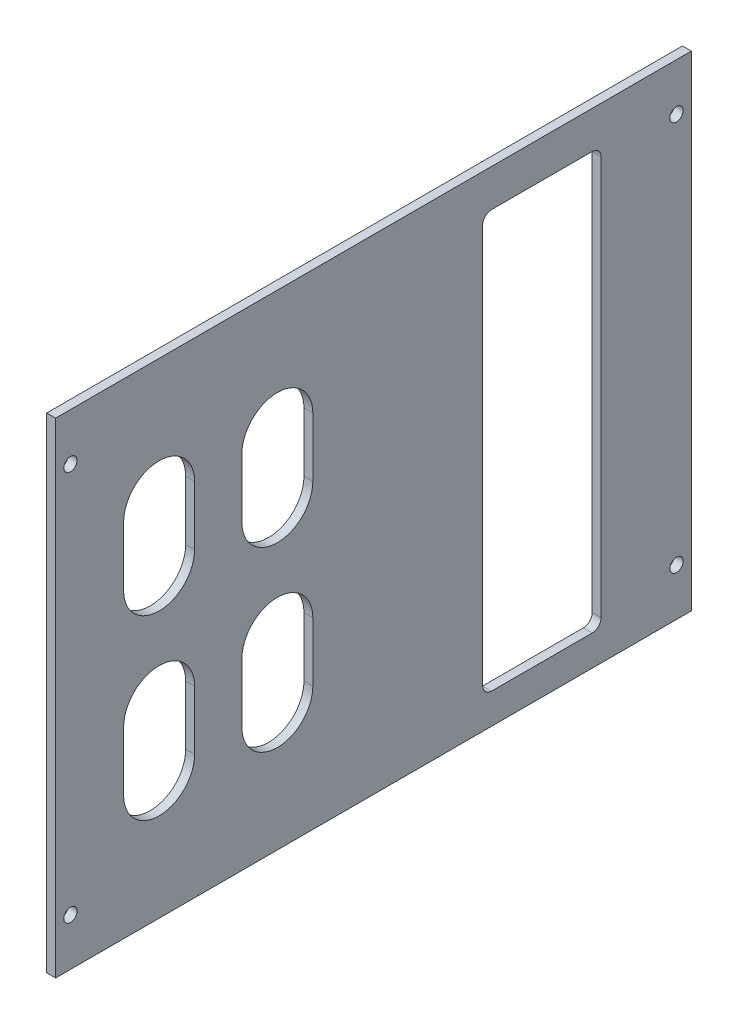
ISO-10303-21;
HEADER;
FILE_DESCRIPTION(('STEP AP214'),'2;1');
FILE_NAME('part.step','',(''),(''),'','','');
FILE_SCHEMA(('AUTOMOTIVE_DESIGN { 1 0 10303 214 1 1 1 1 }'));
ENDSEC;
DATA;
#1=APPLICATION_CONTEXT('core data for automotive mechanical design processes');
#2=APPLICATION_PROTOCOL_DEFINITION('international standard','automotive_design',2000,#1);
#3=PRODUCT_CONTEXT('',#1,'mechanical');
#4=PRODUCT('Part','Part','',(#3));
#5=PRODUCT_RELATED_PRODUCT_CATEGORY('part','',(#4));
#6=PRODUCT_DEFINITION_FORMATION('','',#4);
#7=PRODUCT_DEFINITION_CONTEXT('part definition',#1,'design');
#8=PRODUCT_DEFINITION('design','',#6,#7);
#9=PRODUCT_DEFINITION_SHAPE('','',#8);
#10=(LENGTH_UNIT() NAMED_UNIT(*) SI_UNIT(.MILLI.,.METRE.));
#11=(NAMED_UNIT(*) PLANE_ANGLE_UNIT() SI_UNIT($,.RADIAN.));
#12=(NAMED_UNIT(*) SI_UNIT($,.STERADIAN.) SOLID_ANGLE_UNIT());
#13=UNCERTAINTY_MEASURE_WITH_UNIT(LENGTH_MEASURE(1.E-05),#10,'distance_accuracy_value','');
#14=(GEOMETRIC_REPRESENTATION_CONTEXT(3) GLOBAL_UNCERTAINTY_ASSIGNED_CONTEXT((#13)) GLOBAL_UNIT_ASSIGNED_CONTEXT((#10,
#11,#12)) REPRESENTATION_CONTEXT('',''));
#15=CARTESIAN_POINT('',(0.,0.,0.));
#16=DIRECTION('',(0.,0.,1.));
#17=DIRECTION('',(1.,0.,0.));
#18=AXIS2_PLACEMENT_3D('',#15,#16,#17);
#19=CARTESIAN_POINT('',(120.,0.,0.));
#20=DIRECTION('',(-1.,0.,0.));
#21=DIRECTION('',(0.,-1.,0.));
#22=AXIS2_PLACEMENT_3D('',#19,#20,#21);
#23=PLANE('',#22);
#24=DIRECTION('',(0.,0.,-1.));
#25=VECTOR('',#24,1.);
#26=CARTESIAN_POINT('',(120.,-71.6875198123391,-34.4530254311954));
#27=LINE('',#26,#25);
#28=CARTESIAN_POINT('',(120.,-71.6875198123391,-34.4530254311954));
#29=VERTEX_POINT('',#28);
#30=CARTESIAN_POINT('',(120.,-71.6875198123391,-68.4854696483238));
#31=VERTEX_POINT('',#30);
#32=EDGE_CURVE('E280',#29,#31,#27,.T.);
#33=ORIENTED_EDGE('',*,*,#32,.F.);
#34=CARTESIAN_POINT('',(120.,-68.6875198123391,-34.4530254311954));
#35=DIRECTION('',(1.,0.,0.));
#36=DIRECTION('',(0.,-1.,0.));
#37=AXIS2_PLACEMENT_3D('',#34,#35,#36);
#38=CIRCLE('',#37,3.);
#39=CARTESIAN_POINT('',(120.,-68.6875198123391,-31.4530254311954));
#40=VERTEX_POINT('',#39);
#41=EDGE_CURVE('E72',#40,#29,#38,.T.);
#42=ORIENTED_EDGE('',*,*,#41,.F.);
#43=DIRECTION('',(0.,-1.,0.));
#44=VECTOR('',#43,1.);
#45=CARTESIAN_POINT('',(120.,66.34986058339,-31.4530254311954));
#46=LINE('',#45,#44);
#47=CARTESIAN_POINT('',(120.,66.34986058339,-31.4530254311954));
#48=VERTEX_POINT('',#47);
#49=EDGE_CURVE('E260',#48,#40,#46,.T.);
#50=ORIENTED_EDGE('',*,*,#49,.F.);
#51=CARTESIAN_POINT('',(120.,66.34986058339,-34.4530254311954));
#52=DIRECTION('',(1.,0.,0.));
#53=DIRECTION('',(0.,-1.,0.));
#54=AXIS2_PLACEMENT_3D('',#51,#52,#53);
#55=CIRCLE('',#54,3.);
#56=CARTESIAN_POINT('',(120.,69.34986058339,-34.4530254311954));
#57=VERTEX_POINT('',#56);
#58=EDGE_CURVE('E263',#57,#48,#55,.T.);
#59=ORIENTED_EDGE('',*,*,#58,.F.);
#60=DIRECTION('',(0.,0.,1.));
#61=VECTOR('',#60,1.);
#62=CARTESIAN_POINT('',(120.,69.34986058339,-34.4530254311954));
#63=LINE('',#62,#61);
#64=CARTESIAN_POINT('',(120.,69.34986058339,-68.4854696483238));
#65=VERTEX_POINT('',#64);
#66=EDGE_CURVE('E291',#65,#57,#63,.T.);
#67=ORIENTED_EDGE('',*,*,#66,.F.);
#68=CARTESIAN_POINT('',(120.,66.34986058339,-68.4854696483238));
#69=DIRECTION('',(1.,0.,0.));
#70=DIRECTION('',(0.,1.,0.));
#71=AXIS2_PLACEMENT_3D('',#68,#69,#70);
#72=CIRCLE('',#71,3.);
#73=CARTESIAN_POINT('',(120.,66.34986058339,-71.4854696483238));
#74=VERTEX_POINT('',#73);
#75=EDGE_CURVE('E288',#74,#65,#72,.T.);
#76=ORIENTED_EDGE('',*,*,#75,.F.);
#77=DIRECTION('',(0.,1.,0.));
#78=VECTOR('',#77,1.);
#79=CARTESIAN_POINT('',(120.,66.34986058339,-71.4854696483238));
#80=LINE('',#79,#78);
#81=CARTESIAN_POINT('',(120.,-68.6875198123391,-71.4854696483238));
#82=VERTEX_POINT('',#81);
#83=EDGE_CURVE('E285',#82,#74,#80,.T.);
#84=ORIENTED_EDGE('',*,*,#83,.F.);
#85=CARTESIAN_POINT('',(120.,-68.6875198123391,-68.4854696483238));
#86=DIRECTION('',(1.,0.,0.));
#87=DIRECTION('',(0.,1.,0.));
#88=AXIS2_PLACEMENT_3D('',#85,#86,#87);
#89=CIRCLE('',#88,3.);
#90=EDGE_CURVE('E282',#31,#82,#89,.T.);
#91=ORIENTED_EDGE('',*,*,#90,.F.);
#92=EDGE_LOOP('',(#33,#42,#50,#59,#67,#76,#84,#91));
#93=FACE_BOUND('',#92,.T.);
#94=CARTESIAN_POINT('',(120.,-66.,108.));
#95=DIRECTION('',(-1.,0.,0.));
#96=DIRECTION('',(0.,-1.,0.));
#97=AXIS2_PLACEMENT_3D('',#94,#95,#96);
#98=CIRCLE('',#97,2.25);
#99=CARTESIAN_POINT('',(120.,-68.25,108.));
#100=VERTEX_POINT('',#99);
#101=EDGE_CURVE('E314',#100,#100,#98,.T.);
#102=ORIENTED_EDGE('',*,*,#101,.T.);
#103=EDGE_LOOP('',(#102));
#104=FACE_BOUND('',#103,.T.);
#105=CARTESIAN_POINT('',(120.,66.,108.));
#106=DIRECTION('',(-1.,0.,0.));
#107=DIRECTION('',(0.,-1.,0.));
#108=AXIS2_PLACEMENT_3D('',#105,#106,#107);
#109=CIRCLE('',#108,2.25);
#110=CARTESIAN_POINT('',(120.,63.75,108.));
#111=VERTEX_POINT('',#110);
#112=EDGE_CURVE('E310',#111,#111,#109,.T.);
#113=ORIENTED_EDGE('',*,*,#112,.T.);
#114=EDGE_LOOP('',(#113));
#115=FACE_BOUND('',#114,.T.);
#116=DIRECTION('',(0.,-1.,0.));
#117=VECTOR('',#116,1.);
#118=CARTESIAN_POINT('',(120.,39.9999999999999,90.));
#119=LINE('',#118,#117);
#120=CARTESIAN_POINT('',(120.,40.,90.));
#121=VERTEX_POINT('',#120);
#122=CARTESIAN_POINT('',(120.,19.9999999999999,90.));
#123=VERTEX_POINT('',#122);
#124=EDGE_CURVE('E320',#121,#123,#119,.T.);
#125=ORIENTED_EDGE('',*,*,#124,.F.);
#126=CARTESIAN_POINT('',(120.,39.9999999999999,78.));
#127=DIRECTION('',(1.,0.,0.));
#128=DIRECTION('',(0.,1.,0.));
#129=AXIS2_PLACEMENT_3D('',#126,#127,#128);
#130=CIRCLE('',#129,12.);
#131=CARTESIAN_POINT('',(120.,39.9999999999999,66.));
#132=VERTEX_POINT('',#131);
#133=EDGE_CURVE('E318',#132,#121,#130,.T.);
#134=ORIENTED_EDGE('',*,*,#133,.F.);
#135=DIRECTION('',(0.,1.,0.));
#136=VECTOR('',#135,1.);
#137=CARTESIAN_POINT('',(120.,39.9999999999999,66.));
#138=LINE('',#137,#136);
#139=CARTESIAN_POINT('',(120.,19.9999999999999,66.));
#140=VERTEX_POINT('',#139);
#141=EDGE_CURVE('E327',#140,#132,#138,.T.);
#142=ORIENTED_EDGE('',*,*,#141,.F.);
#143=CARTESIAN_POINT('',(120.,19.9999999999999,78.));
#144=DIRECTION('',(1.,0.,0.));
#145=DIRECTION('',(0.,1.,0.));
#146=AXIS2_PLACEMENT_3D('',#143,#144,#145);
#147=CIRCLE('',#146,12.);
#148=EDGE_CURVE('E324',#123,#140,#147,.T.);
#149=ORIENTED_EDGE('',*,*,#148,.F.);
#150=EDGE_LOOP('',(#125,#134,#142,#149));
#151=FACE_BOUND('',#150,.T.);
#152=DIRECTION('',(0.,1.,0.));
#153=VECTOR('',#152,1.);
#154=CARTESIAN_POINT('',(120.,-40.0000000000001,66.));
#155=LINE('',#154,#153);
#156=CARTESIAN_POINT('',(120.,-40.0000000000001,66.));
#157=VERTEX_POINT('',#156);
#158=CARTESIAN_POINT('',(120.,-20.0000000000001,66.));
#159=VERTEX_POINT('',#158);
#160=EDGE_CURVE('E356',#157,#159,#155,.T.);
#161=ORIENTED_EDGE('',*,*,#160,.F.);
#162=CARTESIAN_POINT('',(120.,-40.0000000000001,78.));
#163=DIRECTION('',(1.,0.,0.));
#164=DIRECTION('',(0.,-1.,0.));
#165=AXIS2_PLACEMENT_3D('',#162,#163,#164);
#166=CIRCLE('',#165,12.);
#167=CARTESIAN_POINT('',(120.,-40.0000000000001,90.));
#168=VERTEX_POINT('',#167);
#169=EDGE_CURVE('E321',#168,#157,#166,.T.);
#170=ORIENTED_EDGE('',*,*,#169,.F.);
#171=DIRECTION('',(0.,-1.,0.));
#172=VECTOR('',#171,1.);
#173=CARTESIAN_POINT('',(120.,-40.0000000000001,90.));
#174=LINE('',#173,#172);
#175=CARTESIAN_POINT('',(120.,-20.0000000000001,90.));
#176=VERTEX_POINT('',#175);
#177=EDGE_CURVE('E343',#176,#168,#174,.T.);
#178=ORIENTED_EDGE('',*,*,#177,.F.);
#179=CARTESIAN_POINT('',(120.,-20.0000000000001,78.));
#180=DIRECTION('',(1.,0.,0.));
#181=DIRECTION('',(0.,-1.,0.));
#182=AXIS2_PLACEMENT_3D('',#179,#180,#181);
#183=CIRCLE('',#182,12.);
#184=EDGE_CURVE('E353',#159,#176,#183,.T.);
#185=ORIENTED_EDGE('',*,*,#184,.F.);
#186=EDGE_LOOP('',(#161,#170,#178,#185));
#187=FACE_BOUND('',#186,.T.);
#188=DIRECTION('',(0.,1.,0.));
#189=VECTOR('',#188,1.);
#190=CARTESIAN_POINT('',(120.,-40.0000000000001,26.));
#191=LINE('',#190,#189);
#192=CARTESIAN_POINT('',(120.,-40.0000000000001,26.));
#193=VERTEX_POINT('',#192);
#194=CARTESIAN_POINT('',(120.,-20.0000000000001,26.));
#195=VERTEX_POINT('',#194);
#196=EDGE_CURVE('E376',#193,#195,#191,.T.);
#197=ORIENTED_EDGE('',*,*,#196,.F.);
#198=CARTESIAN_POINT('',(120.,-40.0000000000001,38.));
#199=DIRECTION('',(1.,0.,0.));
#200=DIRECTION('',(0.,1.,0.));
#201=AXIS2_PLACEMENT_3D('',#198,#199,#200);
#202=CIRCLE('',#201,12.);
#203=CARTESIAN_POINT('',(120.,-40.0000000000001,50.));
#204=VERTEX_POINT('',#203);
#205=EDGE_CURVE('E350',#204,#193,#202,.T.);
#206=ORIENTED_EDGE('',*,*,#205,.F.);
#207=DIRECTION('',(0.,-1.,0.));
#208=VECTOR('',#207,1.);
#209=CARTESIAN_POINT('',(120.,-40.0000000000001,50.));
#210=LINE('',#209,#208);
#211=CARTESIAN_POINT('',(120.,-20.0000000000001,50.));
#212=VERTEX_POINT('',#211);
#213=EDGE_CURVE('E363',#212,#204,#210,.T.);
#214=ORIENTED_EDGE('',*,*,#213,.F.);
#215=CARTESIAN_POINT('',(120.,-20.0000000000001,38.));
#216=DIRECTION('',(1.,0.,0.));
#217=DIRECTION('',(0.,1.,0.));
#218=AXIS2_PLACEMENT_3D('',#215,#216,#217);
#219=CIRCLE('',#218,12.);
#220=EDGE_CURVE('E373',#195,#212,#219,.T.);
#221=ORIENTED_EDGE('',*,*,#220,.F.);
#222=EDGE_LOOP('',(#197,#206,#214,#221));
#223=FACE_BOUND('',#222,.T.);
#224=DIRECTION('',(0.,-1.,0.));
#225=VECTOR('',#224,1.);
#226=CARTESIAN_POINT('',(120.,39.9999999999999,50.));
#227=LINE('',#226,#225);
#228=CARTESIAN_POINT('',(120.,40.,50.));
#229=VERTEX_POINT('',#228);
#230=CARTESIAN_POINT('',(120.,19.9999999999999,50.));
#231=VERTEX_POINT('',#230);
#232=EDGE_CURVE('E394',#229,#231,#227,.T.);
#233=ORIENTED_EDGE('',*,*,#232,.F.);
#234=CARTESIAN_POINT('',(120.,39.9999999999999,38.));
#235=DIRECTION('',(1.,0.,0.));
#236=DIRECTION('',(0.,-1.,0.));
#237=AXIS2_PLACEMENT_3D('',#234,#235,#236);
#238=CIRCLE('',#237,12.);
#239=CARTESIAN_POINT('',(120.,39.9999999999999,26.));
#240=VERTEX_POINT('',#239);
#241=EDGE_CURVE('E370',#240,#229,#238,.T.);
#242=ORIENTED_EDGE('',*,*,#241,.F.);
#243=DIRECTION('',(0.,1.,0.));
#244=VECTOR('',#243,1.);
#245=CARTESIAN_POINT('',(120.,39.9999999999999,26.));
#246=LINE('',#245,#244);
#247=CARTESIAN_POINT('',(120.,19.9999999999999,26.));
#248=VERTEX_POINT('',#247);
#249=EDGE_CURVE('E383',#248,#240,#246,.T.);
#250=ORIENTED_EDGE('',*,*,#249,.F.);
#251=CARTESIAN_POINT('',(120.,19.9999999999999,38.));
#252=DIRECTION('',(1.,0.,0.));
#253=DIRECTION('',(0.,-1.,0.));
#254=AXIS2_PLACEMENT_3D('',#251,#252,#253);
#255=CIRCLE('',#254,12.);
#256=EDGE_CURVE('E391',#231,#248,#255,.T.);
#257=ORIENTED_EDGE('',*,*,#256,.F.);
#258=EDGE_LOOP('',(#233,#242,#250,#257));
#259=FACE_BOUND('',#258,.T.);
#260=DIRECTION('',(0.,-1.,0.));
#261=VECTOR('',#260,1.);
#262=CARTESIAN_POINT('',(120.,-82.,113.));
#263=LINE('',#262,#261);
#264=CARTESIAN_POINT('',(120.,82.,113.));
#265=VERTEX_POINT('',#264);
#266=CARTESIAN_POINT('',(120.,-82.,113.));
#267=VERTEX_POINT('',#266);
#268=EDGE_CURVE('E398',#265,#267,#263,.T.);
#269=ORIENTED_EDGE('',*,*,#268,.T.);
#270=DIRECTION('',(0.,0.,-1.));
#271=VECTOR('',#270,1.);
#272=CARTESIAN_POINT('',(120.,-82.,113.));
#273=LINE('',#272,#271);
#274=CARTESIAN_POINT('',(120.,-82.0000000000001,-102.));
#275=VERTEX_POINT('',#274);
#276=EDGE_CURVE('E401',#267,#275,#273,.T.);
#277=ORIENTED_EDGE('',*,*,#276,.T.);
#278=DIRECTION('',(0.,1.,0.));
#279=VECTOR('',#278,1.);
#280=CARTESIAN_POINT('',(120.,-82.,-102.));
#281=LINE('',#280,#279);
#282=CARTESIAN_POINT('',(120.,82.,-102.));
#283=VERTEX_POINT('',#282);
#284=EDGE_CURVE('E404',#275,#283,#281,.T.);
#285=ORIENTED_EDGE('',*,*,#284,.T.);
#286=DIRECTION('',(0.,0.,1.));
#287=VECTOR('',#286,1.);
#288=CARTESIAN_POINT('',(120.,82.,113.));
#289=LINE('',#288,#287);
#290=EDGE_CURVE('E405',#283,#265,#289,.T.);
#291=ORIENTED_EDGE('',*,*,#290,.T.);
#292=EDGE_LOOP('',(#269,#277,#285,#291));
#293=FACE_BOUND('',#292,.T.);
#294=CARTESIAN_POINT('',(120.,-66.0000000000006,-97.));
#295=DIRECTION('',(-1.,0.,0.));
#296=DIRECTION('',(0.,-1.,0.));
#297=AXIS2_PLACEMENT_3D('',#294,#295,#296);
#298=CIRCLE('',#297,2.25);
#299=CARTESIAN_POINT('',(120.,-68.2500000000006,-97.));
#300=VERTEX_POINT('',#299);
#301=EDGE_CURVE('E412',#300,#300,#298,.F.);
#302=ORIENTED_EDGE('',*,*,#301,.F.);
#303=EDGE_LOOP('',(#302));
#304=FACE_BOUND('',#303,.T.);
#305=CARTESIAN_POINT('',(120.,66.0000000000004,-97.));
#306=DIRECTION('',(-1.,0.,0.));
#307=DIRECTION('',(0.,-1.,0.));
#308=AXIS2_PLACEMENT_3D('',#305,#306,#307);
#309=CIRCLE('',#308,2.25);
#310=CARTESIAN_POINT('',(120.,63.7500000000004,-97.));
#311=VERTEX_POINT('',#310);
#312=EDGE_CURVE('E466',#311,#311,#309,.F.);
#313=ORIENTED_EDGE('',*,*,#312,.F.);
#314=EDGE_LOOP('',(#313));
#315=FACE_BOUND('',#314,.T.);
#316=ADVANCED_FACE('F55',(#93,#104,#115,#151,#187,#223,#259,#293,#304,#315),#23,.F.);
#317=CARTESIAN_POINT('',(117.,0.,0.));
#318=DIRECTION('',(-1.,0.,0.));
#319=DIRECTION('',(0.,-1.,0.));
#320=AXIS2_PLACEMENT_3D('',#317,#318,#319);
#321=PLANE('',#320);
#322=CARTESIAN_POINT('',(117.,-68.6875198123391,-34.4530254311954));
#323=DIRECTION('',(1.,0.,0.));
#324=DIRECTION('',(0.,-1.,0.));
#325=AXIS2_PLACEMENT_3D('',#322,#323,#324);
#326=CIRCLE('',#325,3.);
#327=CARTESIAN_POINT('',(117.,-68.6875198123391,-31.4530254311954));
#328=VERTEX_POINT('',#327);
#329=CARTESIAN_POINT('',(117.,-71.6875198123391,-34.4530254311954));
#330=VERTEX_POINT('',#329);
#331=EDGE_CURVE('E243',#328,#330,#326,.T.);
#332=ORIENTED_EDGE('',*,*,#331,.T.);
#333=DIRECTION('',(0.,0.,-1.));
#334=VECTOR('',#333,1.);
#335=CARTESIAN_POINT('',(117.,-71.6875198123391,-34.4530254311954));
#336=LINE('',#335,#334);
#337=CARTESIAN_POINT('',(117.,-71.6875198123391,-68.4854696483238));
#338=VERTEX_POINT('',#337);
#339=EDGE_CURVE('E252',#330,#338,#336,.T.);
#340=ORIENTED_EDGE('',*,*,#339,.T.);
#341=CARTESIAN_POINT('',(117.,-68.6875198123391,-68.4854696483238));
#342=DIRECTION('',(1.,0.,0.));
#343=DIRECTION('',(0.,1.,0.));
#344=AXIS2_PLACEMENT_3D('',#341,#342,#343);
#345=CIRCLE('',#344,3.);
#346=CARTESIAN_POINT('',(117.,-68.6875198123391,-71.4854696483238));
#347=VERTEX_POINT('',#346);
#348=EDGE_CURVE('E80',#338,#347,#345,.T.);
#349=ORIENTED_EDGE('',*,*,#348,.T.);
#350=DIRECTION('',(0.,1.,0.));
#351=VECTOR('',#350,1.);
#352=CARTESIAN_POINT('',(117.,66.34986058339,-71.4854696483238));
#353=LINE('',#352,#351);
#354=CARTESIAN_POINT('',(117.,66.34986058339,-71.4854696483238));
#355=VERTEX_POINT('',#354);
#356=EDGE_CURVE('E267',#347,#355,#353,.T.);
#357=ORIENTED_EDGE('',*,*,#356,.T.);
#358=CARTESIAN_POINT('',(117.,66.34986058339,-68.4854696483238));
#359=DIRECTION('',(1.,0.,0.));
#360=DIRECTION('',(0.,1.,0.));
#361=AXIS2_PLACEMENT_3D('',#358,#359,#360);
#362=CIRCLE('',#361,3.);
#363=CARTESIAN_POINT('',(117.,69.34986058339,-68.4854696483238));
#364=VERTEX_POINT('',#363);
#365=EDGE_CURVE('E270',#355,#364,#362,.T.);
#366=ORIENTED_EDGE('',*,*,#365,.T.);
#367=DIRECTION('',(0.,0.,1.));
#368=VECTOR('',#367,1.);
#369=CARTESIAN_POINT('',(117.,69.34986058339,-34.4530254311954));
#370=LINE('',#369,#368);
#371=CARTESIAN_POINT('',(117.,69.34986058339,-34.4530254311954));
#372=VERTEX_POINT('',#371);
#373=EDGE_CURVE('E273',#364,#372,#370,.T.);
#374=ORIENTED_EDGE('',*,*,#373,.T.);
#375=CARTESIAN_POINT('',(117.,66.34986058339,-34.4530254311954));
#376=DIRECTION('',(1.,0.,0.));
#377=DIRECTION('',(0.,-1.,0.));
#378=AXIS2_PLACEMENT_3D('',#375,#376,#377);
#379=CIRCLE('',#378,3.);
#380=CARTESIAN_POINT('',(117.,66.34986058339,-31.4530254311954));
#381=VERTEX_POINT('',#380);
#382=EDGE_CURVE('E276',#372,#381,#379,.T.);
#383=ORIENTED_EDGE('',*,*,#382,.T.);
#384=DIRECTION('',(0.,-1.,0.));
#385=VECTOR('',#384,1.);
#386=CARTESIAN_POINT('',(117.,66.34986058339,-31.4530254311954));
#387=LINE('',#386,#385);
#388=EDGE_CURVE('E249',#381,#328,#387,.T.);
#389=ORIENTED_EDGE('',*,*,#388,.T.);
#390=EDGE_LOOP('',(#332,#340,#349,#357,#366,#374,#383,#389));
#391=FACE_BOUND('',#390,.T.);
#392=CARTESIAN_POINT('',(117.,-66.,108.));
#393=DIRECTION('',(-1.,0.,0.));
#394=DIRECTION('',(0.,-1.,0.));
#395=AXIS2_PLACEMENT_3D('',#392,#393,#394);
#396=CIRCLE('',#395,2.25);
#397=CARTESIAN_POINT('',(117.,-68.25,108.));
#398=VERTEX_POINT('',#397);
#399=EDGE_CURVE('E313',#398,#398,#396,.T.);
#400=ORIENTED_EDGE('',*,*,#399,.F.);
#401=EDGE_LOOP('',(#400));
#402=FACE_BOUND('',#401,.T.);
#403=CARTESIAN_POINT('',(117.,66.,108.));
#404=DIRECTION('',(-1.,0.,0.));
#405=DIRECTION('',(0.,-1.,0.));
#406=AXIS2_PLACEMENT_3D('',#403,#404,#405);
#407=CIRCLE('',#406,2.25);
#408=CARTESIAN_POINT('',(117.,63.75,108.));
#409=VERTEX_POINT('',#408);
#410=EDGE_CURVE('E298',#409,#409,#407,.T.);
#411=ORIENTED_EDGE('',*,*,#410,.F.);
#412=EDGE_LOOP('',(#411));
#413=FACE_BOUND('',#412,.T.);
#414=CARTESIAN_POINT('',(117.,39.9999999999999,78.));
#415=DIRECTION('',(-1.,0.,0.));
#416=DIRECTION('',(0.,-1.,0.));
#417=AXIS2_PLACEMENT_3D('',#414,#415,#416);
#418=CIRCLE('',#417,12.);
#419=CARTESIAN_POINT('',(117.,39.9999999999999,90.));
#420=VERTEX_POINT('',#419);
#421=CARTESIAN_POINT('',(117.,39.9999999999999,66.));
#422=VERTEX_POINT('',#421);
#423=EDGE_CURVE('E12',#420,#422,#418,.T.);
#424=ORIENTED_EDGE('',*,*,#423,.F.);
#425=DIRECTION('',(0.,1.,0.));
#426=VECTOR('',#425,1.);
#427=CARTESIAN_POINT('',(117.,0.,90.));
#428=LINE('',#427,#426);
#429=CARTESIAN_POINT('',(117.,19.9999999999999,90.));
#430=VERTEX_POINT('',#429);
#431=EDGE_CURVE('E450',#430,#420,#428,.T.);
#432=ORIENTED_EDGE('',*,*,#431,.F.);
#433=CARTESIAN_POINT('',(117.,19.9999999999999,78.));
#434=DIRECTION('',(-1.,0.,0.));
#435=DIRECTION('',(0.,-1.,0.));
#436=AXIS2_PLACEMENT_3D('',#433,#434,#435);
#437=CIRCLE('',#436,12.);
#438=CARTESIAN_POINT('',(117.,19.9999999999999,66.));
#439=VERTEX_POINT('',#438);
#440=EDGE_CURVE('E452',#439,#430,#437,.T.);
#441=ORIENTED_EDGE('',*,*,#440,.F.);
#442=DIRECTION('',(0.,-1.,0.));
#443=VECTOR('',#442,1.);
#444=CARTESIAN_POINT('',(117.,0.,66.));
#445=LINE('',#444,#443);
#446=EDGE_CURVE('E64',#422,#439,#445,.T.);
#447=ORIENTED_EDGE('',*,*,#446,.F.);
#448=EDGE_LOOP('',(#424,#432,#441,#447));
#449=FACE_BOUND('',#448,.T.);
#450=CARTESIAN_POINT('',(117.,-40.0000000000001,78.));
#451=DIRECTION('',(-1.,0.,0.));
#452=DIRECTION('',(0.,-1.,0.));
#453=AXIS2_PLACEMENT_3D('',#450,#451,#452);
#454=CIRCLE('',#453,12.);
#455=CARTESIAN_POINT('',(117.,-40.0000000000001,66.));
#456=VERTEX_POINT('',#455);
#457=CARTESIAN_POINT('',(117.,-40.0000000000001,90.));
#458=VERTEX_POINT('',#457);
#459=EDGE_CURVE('E448',#456,#458,#454,.T.);
#460=ORIENTED_EDGE('',*,*,#459,.F.);
#461=DIRECTION('',(0.,-1.,0.));
#462=VECTOR('',#461,1.);
#463=CARTESIAN_POINT('',(117.,0.,66.));
#464=LINE('',#463,#462);
#465=CARTESIAN_POINT('',(117.,-19.9999999999999,66.));
#466=VERTEX_POINT('',#465);
#467=EDGE_CURVE('E441',#466,#456,#464,.T.);
#468=ORIENTED_EDGE('',*,*,#467,.F.);
#469=CARTESIAN_POINT('',(117.,-20.0000000000001,78.));
#470=DIRECTION('',(-1.,0.,0.));
#471=DIRECTION('',(0.,-1.,0.));
#472=AXIS2_PLACEMENT_3D('',#469,#470,#471);
#473=CIRCLE('',#472,12.);
#474=CARTESIAN_POINT('',(117.,-20.0000000000001,90.));
#475=VERTEX_POINT('',#474);
#476=EDGE_CURVE('E443',#475,#466,#473,.T.);
#477=ORIENTED_EDGE('',*,*,#476,.F.);
#478=DIRECTION('',(0.,1.,0.));
#479=VECTOR('',#478,1.);
#480=CARTESIAN_POINT('',(117.,-1.41654980428545E-13,90.));
#481=LINE('',#480,#479);
#482=EDGE_CURVE('E446',#458,#475,#481,.T.);
#483=ORIENTED_EDGE('',*,*,#482,.F.);
#484=EDGE_LOOP('',(#460,#468,#477,#483));
#485=FACE_BOUND('',#484,.T.);
#486=CARTESIAN_POINT('',(117.,-40.0000000000001,38.));
#487=DIRECTION('',(-1.,0.,0.));
#488=DIRECTION('',(0.,-1.,0.));
#489=AXIS2_PLACEMENT_3D('',#486,#487,#488);
#490=CIRCLE('',#489,12.);
#491=CARTESIAN_POINT('',(117.,-40.0000000000001,26.));
#492=VERTEX_POINT('',#491);
#493=CARTESIAN_POINT('',(117.,-40.0000000000001,50.));
#494=VERTEX_POINT('',#493);
#495=EDGE_CURVE('E439',#492,#494,#490,.T.);
#496=ORIENTED_EDGE('',*,*,#495,.F.);
#497=DIRECTION('',(0.,-1.,0.));
#498=VECTOR('',#497,1.);
#499=CARTESIAN_POINT('',(117.,0.,26.));
#500=LINE('',#499,#498);
#501=CARTESIAN_POINT('',(117.,-19.9999999999999,26.));
#502=VERTEX_POINT('',#501);
#503=EDGE_CURVE('E432',#502,#492,#500,.T.);
#504=ORIENTED_EDGE('',*,*,#503,.F.);
#505=CARTESIAN_POINT('',(117.,-20.0000000000001,38.));
#506=DIRECTION('',(-1.,0.,0.));
#507=DIRECTION('',(0.,-1.,0.));
#508=AXIS2_PLACEMENT_3D('',#505,#506,#507);
#509=CIRCLE('',#508,12.);
#510=CARTESIAN_POINT('',(117.,-20.0000000000001,50.));
#511=VERTEX_POINT('',#510);
#512=EDGE_CURVE('E434',#511,#502,#509,.T.);
#513=ORIENTED_EDGE('',*,*,#512,.F.);
#514=DIRECTION('',(0.,1.,0.));
#515=VECTOR('',#514,1.);
#516=CARTESIAN_POINT('',(117.,0.,50.));
#517=LINE('',#516,#515);
#518=EDGE_CURVE('E437',#494,#511,#517,.T.);
#519=ORIENTED_EDGE('',*,*,#518,.F.);
#520=EDGE_LOOP('',(#496,#504,#513,#519));
#521=FACE_BOUND('',#520,.T.);
#522=CARTESIAN_POINT('',(117.,39.9999999999999,38.));
#523=DIRECTION('',(-1.,0.,0.));
#524=DIRECTION('',(0.,-1.,0.));
#525=AXIS2_PLACEMENT_3D('',#522,#523,#524);
#526=CIRCLE('',#525,12.);
#527=CARTESIAN_POINT('',(117.,39.9999999999999,50.));
#528=VERTEX_POINT('',#527);
#529=CARTESIAN_POINT('',(117.,39.9999999999999,26.));
#530=VERTEX_POINT('',#529);
#531=EDGE_CURVE('E430',#528,#530,#526,.T.);
#532=ORIENTED_EDGE('',*,*,#531,.F.);
#533=DIRECTION('',(0.,1.,0.));
#534=VECTOR('',#533,1.);
#535=CARTESIAN_POINT('',(117.,0.,50.));
#536=LINE('',#535,#534);
#537=CARTESIAN_POINT('',(117.,19.9999999999999,50.));
#538=VERTEX_POINT('',#537);
#539=EDGE_CURVE('E422',#538,#528,#536,.T.);
#540=ORIENTED_EDGE('',*,*,#539,.F.);
#541=CARTESIAN_POINT('',(117.,19.9999999999999,38.));
#542=DIRECTION('',(-1.,0.,0.));
#543=DIRECTION('',(0.,-1.,0.));
#544=AXIS2_PLACEMENT_3D('',#541,#542,#543);
#545=CIRCLE('',#544,12.);
#546=CARTESIAN_POINT('',(117.,19.9999999999999,26.));
#547=VERTEX_POINT('',#546);
#548=EDGE_CURVE('E425',#547,#538,#545,.T.);
#549=ORIENTED_EDGE('',*,*,#548,.F.);
#550=DIRECTION('',(0.,-1.,0.));
#551=VECTOR('',#550,1.);
#552=CARTESIAN_POINT('',(117.,0.,26.));
#553=LINE('',#552,#551);
#554=EDGE_CURVE('E428',#530,#547,#553,.T.);
#555=ORIENTED_EDGE('',*,*,#554,.F.);
#556=EDGE_LOOP('',(#532,#540,#549,#555));
#557=FACE_BOUND('',#556,.T.);
#558=CARTESIAN_POINT('',(117.,-66.0000000000006,-97.));
#559=DIRECTION('',(-1.,0.,0.));
#560=DIRECTION('',(0.,-1.,0.));
#561=AXIS2_PLACEMENT_3D('',#558,#559,#560);
#562=CIRCLE('',#561,2.25);
#563=CARTESIAN_POINT('',(117.,-68.2500000000006,-97.));
#564=VERTEX_POINT('',#563);
#565=EDGE_CURVE('E59',#564,#564,#562,.F.);
#566=ORIENTED_EDGE('',*,*,#565,.T.);
#567=EDGE_LOOP('',(#566));
#568=FACE_BOUND('',#567,.T.);
#569=DIRECTION('',(0.,-1.,0.));
#570=VECTOR('',#569,1.);
#571=CARTESIAN_POINT('',(117.,-82.,113.));
#572=LINE('',#571,#570);
#573=CARTESIAN_POINT('',(117.,82.,113.));
#574=VERTEX_POINT('',#573);
#575=CARTESIAN_POINT('',(117.,-82.,113.));
#576=VERTEX_POINT('',#575);
#577=EDGE_CURVE('E408',#574,#576,#572,.T.);
#578=ORIENTED_EDGE('',*,*,#577,.F.);
#579=DIRECTION('',(0.,0.,1.));
#580=VECTOR('',#579,1.);
#581=CARTESIAN_POINT('',(117.,82.,113.));
#582=LINE('',#581,#580);
#583=CARTESIAN_POINT('',(117.,82.,-102.));
#584=VERTEX_POINT('',#583);
#585=EDGE_CURVE('E402',#584,#574,#582,.T.);
#586=ORIENTED_EDGE('',*,*,#585,.F.);
#587=DIRECTION('',(0.,1.,0.));
#588=VECTOR('',#587,1.);
#589=CARTESIAN_POINT('',(117.,-82.,-102.));
#590=LINE('',#589,#588);
#591=CARTESIAN_POINT('',(117.,-82.0000000000001,-102.));
#592=VERTEX_POINT('',#591);
#593=EDGE_CURVE('E414',#592,#584,#590,.T.);
#594=ORIENTED_EDGE('',*,*,#593,.F.);
#595=DIRECTION('',(0.,0.,-1.));
#596=VECTOR('',#595,1.);
#597=CARTESIAN_POINT('',(117.,-82.,113.));
#598=LINE('',#597,#596);
#599=EDGE_CURVE('E411',#576,#592,#598,.T.);
#600=ORIENTED_EDGE('',*,*,#599,.F.);
#601=EDGE_LOOP('',(#578,#586,#594,#600));
#602=FACE_BOUND('',#601,.T.);
#603=CARTESIAN_POINT('',(117.,66.0000000000004,-97.));
#604=DIRECTION('',(-1.,0.,0.));
#605=DIRECTION('',(0.,-1.,0.));
#606=AXIS2_PLACEMENT_3D('',#603,#604,#605);
#607=CIRCLE('',#606,2.25);
#608=CARTESIAN_POINT('',(117.,63.7500000000004,-97.));
#609=VERTEX_POINT('',#608);
#610=EDGE_CURVE('E333',#609,#609,#607,.F.);
#611=ORIENTED_EDGE('',*,*,#610,.T.);
#612=EDGE_LOOP('',(#611));
#613=FACE_BOUND('',#612,.T.);
#614=ADVANCED_FACE('F256',(#391,#402,#413,#449,#485,#521,#557,#568,#602,#613),#321,.T.);
#615=CARTESIAN_POINT('',(120.,-82.,113.));
#616=DIRECTION('',(0.,0.,-1.));
#617=DIRECTION('',(-1.,0.,0.));
#618=AXIS2_PLACEMENT_3D('',#615,#616,#617);
#619=PLANE('',#618);
#620=ORIENTED_EDGE('',*,*,#577,.T.);
#621=DIRECTION('',(-1.,0.,0.));
#622=VECTOR('',#621,1.);
#623=CARTESIAN_POINT('',(120.,-82.,113.));
#624=LINE('',#623,#622);
#625=EDGE_CURVE('E419',#267,#576,#624,.T.);
#626=ORIENTED_EDGE('',*,*,#625,.F.);
#627=ORIENTED_EDGE('',*,*,#268,.F.);
#628=DIRECTION('',(-1.,0.,0.));
#629=VECTOR('',#628,1.);
#630=CARTESIAN_POINT('',(120.,82.,113.));
#631=LINE('',#630,#629);
#632=EDGE_CURVE('E407',#265,#574,#631,.T.);
#633=ORIENTED_EDGE('',*,*,#632,.T.);
#634=EDGE_LOOP('',(#620,#626,#627,#633));
#635=FACE_BOUND('',#634,.T.);
#636=ADVANCED_FACE('F497',(#635),#619,.F.);
#637=CARTESIAN_POINT('',(120.,-82.,113.));
#638=DIRECTION('',(0.,1.,0.));
#639=DIRECTION('',(-1.,0.,0.));
#640=AXIS2_PLACEMENT_3D('',#637,#638,#639);
#641=PLANE('',#640);
#642=ORIENTED_EDGE('',*,*,#599,.T.);
#643=DIRECTION('',(-1.,0.,0.));
#644=VECTOR('',#643,1.);
#645=CARTESIAN_POINT('',(120.,-82.,-102.));
#646=LINE('',#645,#644);
#647=EDGE_CURVE('E423',#275,#592,#646,.T.);
#648=ORIENTED_EDGE('',*,*,#647,.F.);
#649=ORIENTED_EDGE('',*,*,#276,.F.);
#650=ORIENTED_EDGE('',*,*,#625,.T.);
#651=EDGE_LOOP('',(#642,#648,#649,#650));
#652=FACE_BOUND('',#651,.T.);
#653=ADVANCED_FACE('F504',(#652),#641,.F.);
#654=CARTESIAN_POINT('',(120.,-82.,-102.));
#655=DIRECTION('',(0.,0.,1.));
#656=DIRECTION('',(0.,-1.,0.));
#657=AXIS2_PLACEMENT_3D('',#654,#655,#656);
#658=PLANE('',#657);
#659=ORIENTED_EDGE('',*,*,#593,.T.);
#660=DIRECTION('',(-1.,0.,0.));
#661=VECTOR('',#660,1.);
#662=CARTESIAN_POINT('',(120.,82.,-102.));
#663=LINE('',#662,#661);
#664=EDGE_CURVE('E418',#283,#584,#663,.T.);
#665=ORIENTED_EDGE('',*,*,#664,.F.);
#666=ORIENTED_EDGE('',*,*,#284,.F.);
#667=ORIENTED_EDGE('',*,*,#647,.T.);
#668=EDGE_LOOP('',(#659,#665,#666,#667));
#669=FACE_BOUND('',#668,.T.);
#670=ADVANCED_FACE('F487',(#669),#658,.F.);
#671=CARTESIAN_POINT('',(120.,82.,113.));
#672=DIRECTION('',(0.,-1.,0.));
#673=DIRECTION('',(1.,0.,0.));
#674=AXIS2_PLACEMENT_3D('',#671,#672,#673);
#675=PLANE('',#674);
#676=ORIENTED_EDGE('',*,*,#585,.T.);
#677=ORIENTED_EDGE('',*,*,#632,.F.);
#678=ORIENTED_EDGE('',*,*,#290,.F.);
#679=ORIENTED_EDGE('',*,*,#664,.T.);
#680=EDGE_LOOP('',(#676,#677,#678,#679));
#681=FACE_BOUND('',#680,.T.);
#682=ADVANCED_FACE('F480',(#681),#675,.F.);
#683=CARTESIAN_POINT('',(120.,-66.0000000000006,-97.));
#684=DIRECTION('',(-1.,0.,0.));
#685=DIRECTION('',(0.,-1.,0.));
#686=AXIS2_PLACEMENT_3D('',#683,#684,#685);
#687=CYLINDRICAL_SURFACE('',#686,2.25);
#688=ORIENTED_EDGE('',*,*,#301,.T.);
#689=EDGE_LOOP('',(#688));
#690=FACE_BOUND('',#689,.T.);
#691=ORIENTED_EDGE('',*,*,#565,.F.);
#692=EDGE_LOOP('',(#691));
#693=FACE_BOUND('',#692,.T.);
#694=ADVANCED_FACE('F478',(#690,#693),#687,.F.);
#695=CARTESIAN_POINT('',(120.,66.0000000000004,-97.));
#696=DIRECTION('',(-1.,0.,0.));
#697=DIRECTION('',(0.,-1.,0.));
#698=AXIS2_PLACEMENT_3D('',#695,#696,#697);
#699=CYLINDRICAL_SURFACE('',#698,2.25);
#700=ORIENTED_EDGE('',*,*,#312,.T.);
#701=EDGE_LOOP('',(#700));
#702=FACE_BOUND('',#701,.T.);
#703=ORIENTED_EDGE('',*,*,#610,.F.);
#704=EDGE_LOOP('',(#703));
#705=FACE_BOUND('',#704,.T.);
#706=ADVANCED_FACE('F57',(#702,#705),#699,.F.);
#707=CARTESIAN_POINT('',(-120.,40.0000000000001,38.));
#708=DIRECTION('',(1.,0.,0.));
#709=DIRECTION('',(0.,1.,0.));
#710=AXIS2_PLACEMENT_3D('',#707,#708,#709);
#711=CYLINDRICAL_SURFACE('',#710,12.);
#712=ORIENTED_EDGE('',*,*,#531,.T.);
#713=DIRECTION('',(1.,0.,0.));
#714=VECTOR('',#713,1.);
#715=CARTESIAN_POINT('',(-120.,40.,26.));
#716=LINE('',#715,#714);
#717=EDGE_CURVE('E317',#530,#240,#716,.T.);
#718=ORIENTED_EDGE('',*,*,#717,.T.);
#719=ORIENTED_EDGE('',*,*,#241,.T.);
#720=DIRECTION('',(1.,0.,0.));
#721=VECTOR('',#720,1.);
#722=CARTESIAN_POINT('',(-120.,40.,50.));
#723=LINE('',#722,#721);
#724=EDGE_CURVE('E380',#528,#229,#723,.T.);
#725=ORIENTED_EDGE('',*,*,#724,.F.);
#726=EDGE_LOOP('',(#712,#718,#719,#725));
#727=FACE_BOUND('',#726,.T.);
#728=ADVANCED_FACE('F485',(#727),#711,.F.);
#729=CARTESIAN_POINT('',(-120.,40.,26.));
#730=DIRECTION('',(0.,0.,-1.));
#731=DIRECTION('',(0.,1.,0.));
#732=AXIS2_PLACEMENT_3D('',#729,#730,#731);
#733=PLANE('',#732);
#734=ORIENTED_EDGE('',*,*,#554,.T.);
#735=DIRECTION('',(1.,0.,0.));
#736=VECTOR('',#735,1.);
#737=CARTESIAN_POINT('',(-120.,20.0000000000001,26.));
#738=LINE('',#737,#736);
#739=EDGE_CURVE('E386',#547,#248,#738,.T.);
#740=ORIENTED_EDGE('',*,*,#739,.T.);
#741=ORIENTED_EDGE('',*,*,#249,.T.);
#742=ORIENTED_EDGE('',*,*,#717,.F.);
#743=EDGE_LOOP('',(#734,#740,#741,#742));
#744=FACE_BOUND('',#743,.T.);
#745=ADVANCED_FACE('F501',(#744),#733,.F.);
#746=CARTESIAN_POINT('',(-120.,20.0000000000001,38.));
#747=DIRECTION('',(1.,0.,0.));
#748=DIRECTION('',(0.,1.,0.));
#749=AXIS2_PLACEMENT_3D('',#746,#747,#748);
#750=CYLINDRICAL_SURFACE('',#749,12.);
#751=ORIENTED_EDGE('',*,*,#548,.T.);
#752=DIRECTION('',(1.,0.,0.));
#753=VECTOR('',#752,1.);
#754=CARTESIAN_POINT('',(-120.,20.,50.));
#755=LINE('',#754,#753);
#756=EDGE_CURVE('E384',#538,#231,#755,.T.);
#757=ORIENTED_EDGE('',*,*,#756,.T.);
#758=ORIENTED_EDGE('',*,*,#256,.T.);
#759=ORIENTED_EDGE('',*,*,#739,.F.);
#760=EDGE_LOOP('',(#751,#757,#758,#759));
#761=FACE_BOUND('',#760,.T.);
#762=ADVANCED_FACE('F568',(#761),#750,.F.);
#763=CARTESIAN_POINT('',(-120.,40.,50.));
#764=DIRECTION('',(0.,0.,1.));
#765=DIRECTION('',(1.,0.,0.));
#766=AXIS2_PLACEMENT_3D('',#763,#764,#765);
#767=PLANE('',#766);
#768=ORIENTED_EDGE('',*,*,#539,.T.);
#769=ORIENTED_EDGE('',*,*,#724,.T.);
#770=ORIENTED_EDGE('',*,*,#232,.T.);
#771=ORIENTED_EDGE('',*,*,#756,.F.);
#772=EDGE_LOOP('',(#768,#769,#770,#771));
#773=FACE_BOUND('',#772,.T.);
#774=ADVANCED_FACE('F577',(#773),#767,.F.);
#775=CARTESIAN_POINT('',(-120.,-39.9999999999999,38.));
#776=DIRECTION('',(1.,0.,0.));
#777=DIRECTION('',(0.,1.,0.));
#778=AXIS2_PLACEMENT_3D('',#775,#776,#777);
#779=CYLINDRICAL_SURFACE('',#778,12.);
#780=ORIENTED_EDGE('',*,*,#495,.T.);
#781=DIRECTION('',(1.,0.,0.));
#782=VECTOR('',#781,1.);
#783=CARTESIAN_POINT('',(-120.,-39.9999999999999,50.));
#784=LINE('',#783,#782);
#785=EDGE_CURVE('E368',#494,#204,#784,.T.);
#786=ORIENTED_EDGE('',*,*,#785,.T.);
#787=ORIENTED_EDGE('',*,*,#205,.T.);
#788=DIRECTION('',(1.,0.,0.));
#789=VECTOR('',#788,1.);
#790=CARTESIAN_POINT('',(-120.,-39.9999999999999,26.));
#791=LINE('',#790,#789);
#792=EDGE_CURVE('E360',#492,#193,#791,.T.);
#793=ORIENTED_EDGE('',*,*,#792,.F.);
#794=EDGE_LOOP('',(#780,#786,#787,#793));
#795=FACE_BOUND('',#794,.T.);
#796=ADVANCED_FACE('F586',(#795),#779,.F.);
#797=CARTESIAN_POINT('',(-120.,-39.9999999999999,50.));
#798=DIRECTION('',(0.,0.,1.));
#799=DIRECTION('',(1.,0.,0.));
#800=AXIS2_PLACEMENT_3D('',#797,#798,#799);
#801=PLANE('',#800);
#802=ORIENTED_EDGE('',*,*,#518,.T.);
#803=DIRECTION('',(1.,0.,0.));
#804=VECTOR('',#803,1.);
#805=CARTESIAN_POINT('',(-120.,-19.9999999999999,50.));
#806=LINE('',#805,#804);
#807=EDGE_CURVE('E366',#511,#212,#806,.T.);
#808=ORIENTED_EDGE('',*,*,#807,.T.);
#809=ORIENTED_EDGE('',*,*,#213,.T.);
#810=ORIENTED_EDGE('',*,*,#785,.F.);
#811=EDGE_LOOP('',(#802,#808,#809,#810));
#812=FACE_BOUND('',#811,.T.);
#813=ADVANCED_FACE('F596',(#812),#801,.F.);
#814=CARTESIAN_POINT('',(-120.,-19.9999999999999,38.));
#815=DIRECTION('',(1.,0.,0.));
#816=DIRECTION('',(0.,1.,0.));
#817=AXIS2_PLACEMENT_3D('',#814,#815,#816);
#818=CYLINDRICAL_SURFACE('',#817,12.);
#819=ORIENTED_EDGE('',*,*,#512,.T.);
#820=DIRECTION('',(1.,0.,0.));
#821=VECTOR('',#820,1.);
#822=CARTESIAN_POINT('',(-120.,-19.9999999999999,26.));
#823=LINE('',#822,#821);
#824=EDGE_CURVE('E364',#502,#195,#823,.T.);
#825=ORIENTED_EDGE('',*,*,#824,.T.);
#826=ORIENTED_EDGE('',*,*,#220,.T.);
#827=ORIENTED_EDGE('',*,*,#807,.F.);
#828=EDGE_LOOP('',(#819,#825,#826,#827));
#829=FACE_BOUND('',#828,.T.);
#830=ADVANCED_FACE('F606',(#829),#818,.F.);
#831=CARTESIAN_POINT('',(-120.,-39.9999999999999,26.));
#832=DIRECTION('',(0.,0.,-1.));
#833=DIRECTION('',(0.,1.,0.));
#834=AXIS2_PLACEMENT_3D('',#831,#832,#833);
#835=PLANE('',#834);
#836=ORIENTED_EDGE('',*,*,#503,.T.);
#837=ORIENTED_EDGE('',*,*,#792,.T.);
#838=ORIENTED_EDGE('',*,*,#196,.T.);
#839=ORIENTED_EDGE('',*,*,#824,.F.);
#840=EDGE_LOOP('',(#836,#837,#838,#839));
#841=FACE_BOUND('',#840,.T.);
#842=ADVANCED_FACE('F616',(#841),#835,.F.);
#843=CARTESIAN_POINT('',(-120.,-39.9999999999999,78.));
#844=DIRECTION('',(1.,0.,0.));
#845=DIRECTION('',(0.,1.,0.));
#846=AXIS2_PLACEMENT_3D('',#843,#844,#845);
#847=CYLINDRICAL_SURFACE('',#846,12.);
#848=ORIENTED_EDGE('',*,*,#459,.T.);
#849=DIRECTION('',(1.,0.,0.));
#850=VECTOR('',#849,1.);
#851=CARTESIAN_POINT('',(-120.,-39.9999999999999,90.));
#852=LINE('',#851,#850);
#853=EDGE_CURVE('E348',#458,#168,#852,.T.);
#854=ORIENTED_EDGE('',*,*,#853,.T.);
#855=ORIENTED_EDGE('',*,*,#169,.T.);
#856=DIRECTION('',(1.,0.,0.));
#857=VECTOR('',#856,1.);
#858=CARTESIAN_POINT('',(-120.,-39.9999999999999,66.));
#859=LINE('',#858,#857);
#860=EDGE_CURVE('E340',#456,#157,#859,.T.);
#861=ORIENTED_EDGE('',*,*,#860,.F.);
#862=EDGE_LOOP('',(#848,#854,#855,#861));
#863=FACE_BOUND('',#862,.T.);
#864=ADVANCED_FACE('F626',(#863),#847,.F.);
#865=CARTESIAN_POINT('',(-120.,-39.9999999999999,90.));
#866=DIRECTION('',(0.,0.,1.));
#867=DIRECTION('',(0.,-1.,0.));
#868=AXIS2_PLACEMENT_3D('',#865,#866,#867);
#869=PLANE('',#868);
#870=ORIENTED_EDGE('',*,*,#482,.T.);
#871=DIRECTION('',(1.,0.,0.));
#872=VECTOR('',#871,1.);
#873=CARTESIAN_POINT('',(-120.,-19.9999999999999,90.));
#874=LINE('',#873,#872);
#875=EDGE_CURVE('E346',#475,#176,#874,.T.);
#876=ORIENTED_EDGE('',*,*,#875,.T.);
#877=ORIENTED_EDGE('',*,*,#177,.T.);
#878=ORIENTED_EDGE('',*,*,#853,.F.);
#879=EDGE_LOOP('',(#870,#876,#877,#878));
#880=FACE_BOUND('',#879,.T.);
#881=ADVANCED_FACE('F636',(#880),#869,.F.);
#882=CARTESIAN_POINT('',(-120.,-19.9999999999999,78.));
#883=DIRECTION('',(1.,0.,0.));
#884=DIRECTION('',(0.,1.,0.));
#885=AXIS2_PLACEMENT_3D('',#882,#883,#884);
#886=CYLINDRICAL_SURFACE('',#885,12.);
#887=ORIENTED_EDGE('',*,*,#476,.T.);
#888=DIRECTION('',(1.,0.,0.));
#889=VECTOR('',#888,1.);
#890=CARTESIAN_POINT('',(-120.,-19.9999999999999,66.));
#891=LINE('',#890,#889);
#892=EDGE_CURVE('E344',#466,#159,#891,.T.);
#893=ORIENTED_EDGE('',*,*,#892,.T.);
#894=ORIENTED_EDGE('',*,*,#184,.T.);
#895=ORIENTED_EDGE('',*,*,#875,.F.);
#896=EDGE_LOOP('',(#887,#893,#894,#895));
#897=FACE_BOUND('',#896,.T.);
#898=ADVANCED_FACE('F646',(#897),#886,.F.);
#899=CARTESIAN_POINT('',(-120.,-39.9999999999999,66.));
#900=DIRECTION('',(0.,0.,-1.));
#901=DIRECTION('',(-1.,0.,0.));
#902=AXIS2_PLACEMENT_3D('',#899,#900,#901);
#903=PLANE('',#902);
#904=ORIENTED_EDGE('',*,*,#467,.T.);
#905=ORIENTED_EDGE('',*,*,#860,.T.);
#906=ORIENTED_EDGE('',*,*,#160,.T.);
#907=ORIENTED_EDGE('',*,*,#892,.F.);
#908=EDGE_LOOP('',(#904,#905,#906,#907));
#909=FACE_BOUND('',#908,.T.);
#910=ADVANCED_FACE('F656',(#909),#903,.F.);
#911=CARTESIAN_POINT('',(-120.,40.,78.));
#912=DIRECTION('',(1.,0.,0.));
#913=DIRECTION('',(0.,1.,0.));
#914=AXIS2_PLACEMENT_3D('',#911,#912,#913);
#915=CYLINDRICAL_SURFACE('',#914,12.);
#916=ORIENTED_EDGE('',*,*,#423,.T.);
#917=DIRECTION('',(1.,0.,0.));
#918=VECTOR('',#917,1.);
#919=CARTESIAN_POINT('',(-120.,40.,66.));
#920=LINE('',#919,#918);
#921=EDGE_CURVE('E331',#422,#132,#920,.T.);
#922=ORIENTED_EDGE('',*,*,#921,.T.);
#923=ORIENTED_EDGE('',*,*,#133,.T.);
#924=DIRECTION('',(1.,0.,0.));
#925=VECTOR('',#924,1.);
#926=CARTESIAN_POINT('',(-120.,40.,90.));
#927=LINE('',#926,#925);
#928=EDGE_CURVE('E330',#420,#121,#927,.T.);
#929=ORIENTED_EDGE('',*,*,#928,.F.);
#930=EDGE_LOOP('',(#916,#922,#923,#929));
#931=FACE_BOUND('',#930,.T.);
#932=ADVANCED_FACE('F666',(#931),#915,.F.);
#933=CARTESIAN_POINT('',(-120.,40.,66.));
#934=DIRECTION('',(0.,0.,-1.));
#935=DIRECTION('',(-1.,0.,0.));
#936=AXIS2_PLACEMENT_3D('',#933,#934,#935);
#937=PLANE('',#936);
#938=ORIENTED_EDGE('',*,*,#446,.T.);
#939=DIRECTION('',(1.,0.,0.));
#940=VECTOR('',#939,1.);
#941=CARTESIAN_POINT('',(-120.,20.,66.));
#942=LINE('',#941,#940);
#943=EDGE_CURVE('E334',#439,#140,#942,.T.);
#944=ORIENTED_EDGE('',*,*,#943,.T.);
#945=ORIENTED_EDGE('',*,*,#141,.T.);
#946=ORIENTED_EDGE('',*,*,#921,.F.);
#947=EDGE_LOOP('',(#938,#944,#945,#946));
#948=FACE_BOUND('',#947,.T.);
#949=ADVANCED_FACE('F676',(#948),#937,.F.);
#950=CARTESIAN_POINT('',(-120.,20.,78.));
#951=DIRECTION('',(1.,0.,0.));
#952=DIRECTION('',(0.,1.,0.));
#953=AXIS2_PLACEMENT_3D('',#950,#951,#952);
#954=CYLINDRICAL_SURFACE('',#953,12.);
#955=ORIENTED_EDGE('',*,*,#440,.T.);
#956=DIRECTION('',(1.,0.,0.));
#957=VECTOR('',#956,1.);
#958=CARTESIAN_POINT('',(-120.,20.0000000000001,90.));
#959=LINE('',#958,#957);
#960=EDGE_CURVE('E336',#430,#123,#959,.T.);
#961=ORIENTED_EDGE('',*,*,#960,.T.);
#962=ORIENTED_EDGE('',*,*,#148,.T.);
#963=ORIENTED_EDGE('',*,*,#943,.F.);
#964=EDGE_LOOP('',(#955,#961,#962,#963));
#965=FACE_BOUND('',#964,.T.);
#966=ADVANCED_FACE('F686',(#965),#954,.F.);
#967=CARTESIAN_POINT('',(-120.,40.,90.));
#968=DIRECTION('',(0.,0.,1.));
#969=DIRECTION('',(0.,-1.,0.));
#970=AXIS2_PLACEMENT_3D('',#967,#968,#969);
#971=PLANE('',#970);
#972=ORIENTED_EDGE('',*,*,#431,.T.);
#973=ORIENTED_EDGE('',*,*,#928,.T.);
#974=ORIENTED_EDGE('',*,*,#124,.T.);
#975=ORIENTED_EDGE('',*,*,#960,.F.);
#976=EDGE_LOOP('',(#972,#973,#974,#975));
#977=FACE_BOUND('',#976,.T.);
#978=ADVANCED_FACE('F696',(#977),#971,.F.);
#979=CARTESIAN_POINT('',(120.01,66.,108.));
#980=DIRECTION('',(-1.,0.,0.));
#981=DIRECTION('',(0.,0.,1.));
#982=AXIS2_PLACEMENT_3D('',#979,#980,#981);
#983=CYLINDRICAL_SURFACE('',#982,2.25);
#984=ORIENTED_EDGE('',*,*,#410,.T.);
#985=EDGE_LOOP('',(#984));
#986=FACE_BOUND('',#985,.T.);
#987=ORIENTED_EDGE('',*,*,#112,.F.);
#988=EDGE_LOOP('',(#987));
#989=FACE_BOUND('',#988,.T.);
#990=ADVANCED_FACE('F706',(#986,#989),#983,.F.);
#991=CARTESIAN_POINT('',(120.01,-66.,108.));
#992=DIRECTION('',(-1.,0.,0.));
#993=DIRECTION('',(0.,0.,1.));
#994=AXIS2_PLACEMENT_3D('',#991,#992,#993);
#995=CYLINDRICAL_SURFACE('',#994,2.25);
#996=ORIENTED_EDGE('',*,*,#399,.T.);
#997=EDGE_LOOP('',(#996));
#998=FACE_BOUND('',#997,.T.);
#999=ORIENTED_EDGE('',*,*,#101,.F.);
#1000=EDGE_LOOP('',(#999));
#1001=FACE_BOUND('',#1000,.T.);
#1002=ADVANCED_FACE('F716',(#998,#1001),#995,.F.);
#1003=CARTESIAN_POINT('',(117.,-68.6875198123391,-34.4530254311954));
#1004=DIRECTION('',(1.,0.,0.));
#1005=DIRECTION('',(0.,1.,0.));
#1006=AXIS2_PLACEMENT_3D('',#1003,#1004,#1005);
#1007=CYLINDRICAL_SURFACE('',#1006,3.);
#1008=ORIENTED_EDGE('',*,*,#41,.T.);
#1009=DIRECTION('',(1.,0.,0.));
#1010=VECTOR('',#1009,1.);
#1011=CARTESIAN_POINT('',(117.,-71.6875198123391,-34.4530254311954));
#1012=LINE('',#1011,#1010);
#1013=EDGE_CURVE('E239',#330,#29,#1012,.T.);
#1014=ORIENTED_EDGE('',*,*,#1013,.F.);
#1015=ORIENTED_EDGE('',*,*,#331,.F.);
#1016=DIRECTION('',(1.,0.,0.));
#1017=VECTOR('',#1016,1.);
#1018=CARTESIAN_POINT('',(117.,-68.6875198123391,-31.4530254311954));
#1019=LINE('',#1018,#1017);
#1020=EDGE_CURVE('E296',#328,#40,#1019,.T.);
#1021=ORIENTED_EDGE('',*,*,#1020,.T.);
#1022=EDGE_LOOP('',(#1008,#1014,#1015,#1021));
#1023=FACE_BOUND('',#1022,.T.);
#1024=ADVANCED_FACE('F241',(#1023),#1007,.F.);
#1025=CARTESIAN_POINT('',(117.,66.34986058339,-31.4530254311954));
#1026=DIRECTION('',(0.,0.,1.));
#1027=DIRECTION('',(1.,0.,0.));
#1028=AXIS2_PLACEMENT_3D('',#1025,#1026,#1027);
#1029=PLANE('',#1028);
#1030=ORIENTED_EDGE('',*,*,#49,.T.);
#1031=ORIENTED_EDGE('',*,*,#1020,.F.);
#1032=ORIENTED_EDGE('',*,*,#388,.F.);
#1033=DIRECTION('',(1.,0.,0.));
#1034=VECTOR('',#1033,1.);
#1035=CARTESIAN_POINT('',(117.,66.34986058339,-31.4530254311954));
#1036=LINE('',#1035,#1034);
#1037=EDGE_CURVE('E299',#381,#48,#1036,.T.);
#1038=ORIENTED_EDGE('',*,*,#1037,.T.);
#1039=EDGE_LOOP('',(#1030,#1031,#1032,#1038));
#1040=FACE_BOUND('',#1039,.T.);
#1041=ADVANCED_FACE('F734',(#1040),#1029,.F.);
#1042=CARTESIAN_POINT('',(117.,66.34986058339,-34.4530254311954));
#1043=DIRECTION('',(1.,0.,0.));
#1044=DIRECTION('',(0.,1.,0.));
#1045=AXIS2_PLACEMENT_3D('',#1042,#1043,#1044);
#1046=CYLINDRICAL_SURFACE('',#1045,3.);
#1047=ORIENTED_EDGE('',*,*,#58,.T.);
#1048=ORIENTED_EDGE('',*,*,#1037,.F.);
#1049=ORIENTED_EDGE('',*,*,#382,.F.);
#1050=DIRECTION('',(1.,0.,0.));
#1051=VECTOR('',#1050,1.);
#1052=CARTESIAN_POINT('',(117.,69.34986058339,-34.4530254311954));
#1053=LINE('',#1052,#1051);
#1054=EDGE_CURVE('E301',#372,#57,#1053,.T.);
#1055=ORIENTED_EDGE('',*,*,#1054,.T.);
#1056=EDGE_LOOP('',(#1047,#1048,#1049,#1055));
#1057=FACE_BOUND('',#1056,.T.);
#1058=ADVANCED_FACE('F743',(#1057),#1046,.F.);
#1059=CARTESIAN_POINT('',(117.,69.34986058339,-34.4530254311954));
#1060=DIRECTION('',(0.,1.,0.));
#1061=DIRECTION('',(-1.,0.,0.));
#1062=AXIS2_PLACEMENT_3D('',#1059,#1060,#1061);
#1063=PLANE('',#1062);
#1064=ORIENTED_EDGE('',*,*,#66,.T.);
#1065=ORIENTED_EDGE('',*,*,#1054,.F.);
#1066=ORIENTED_EDGE('',*,*,#373,.F.);
#1067=DIRECTION('',(1.,0.,0.));
#1068=VECTOR('',#1067,1.);
#1069=CARTESIAN_POINT('',(117.,69.34986058339,-68.4854696483238));
#1070=LINE('',#1069,#1068);
#1071=EDGE_CURVE('E303',#364,#65,#1070,.T.);
#1072=ORIENTED_EDGE('',*,*,#1071,.T.);
#1073=EDGE_LOOP('',(#1064,#1065,#1066,#1072));
#1074=FACE_BOUND('',#1073,.T.);
#1075=ADVANCED_FACE('F753',(#1074),#1063,.F.);
#1076=CARTESIAN_POINT('',(117.,66.34986058339,-68.4854696483238));
#1077=DIRECTION('',(1.,0.,0.));
#1078=DIRECTION('',(0.,1.,0.));
#1079=AXIS2_PLACEMENT_3D('',#1076,#1077,#1078);
#1080=CYLINDRICAL_SURFACE('',#1079,3.);
#1081=ORIENTED_EDGE('',*,*,#75,.T.);
#1082=ORIENTED_EDGE('',*,*,#1071,.F.);
#1083=ORIENTED_EDGE('',*,*,#365,.F.);
#1084=DIRECTION('',(1.,0.,0.));
#1085=VECTOR('',#1084,1.);
#1086=CARTESIAN_POINT('',(117.,66.34986058339,-71.4854696483238));
#1087=LINE('',#1086,#1085);
#1088=EDGE_CURVE('E305',#355,#74,#1087,.T.);
#1089=ORIENTED_EDGE('',*,*,#1088,.T.);
#1090=EDGE_LOOP('',(#1081,#1082,#1083,#1089));
#1091=FACE_BOUND('',#1090,.T.);
#1092=ADVANCED_FACE('F763',(#1091),#1080,.F.);
#1093=CARTESIAN_POINT('',(117.,66.34986058339,-71.4854696483238));
#1094=DIRECTION('',(0.,0.,-1.));
#1095=DIRECTION('',(-1.,0.,0.));
#1096=AXIS2_PLACEMENT_3D('',#1093,#1094,#1095);
#1097=PLANE('',#1096);
#1098=ORIENTED_EDGE('',*,*,#83,.T.);
#1099=ORIENTED_EDGE('',*,*,#1088,.F.);
#1100=ORIENTED_EDGE('',*,*,#356,.F.);
#1101=DIRECTION('',(1.,0.,0.));
#1102=VECTOR('',#1101,1.);
#1103=CARTESIAN_POINT('',(117.,-68.6875198123391,-71.4854696483238));
#1104=LINE('',#1103,#1102);
#1105=EDGE_CURVE('E307',#347,#82,#1104,.T.);
#1106=ORIENTED_EDGE('',*,*,#1105,.T.);
#1107=EDGE_LOOP('',(#1098,#1099,#1100,#1106));
#1108=FACE_BOUND('',#1107,.T.);
#1109=ADVANCED_FACE('F773',(#1108),#1097,.F.);
#1110=CARTESIAN_POINT('',(117.,-68.6875198123391,-68.4854696483238));
#1111=DIRECTION('',(1.,0.,0.));
#1112=DIRECTION('',(0.,1.,0.));
#1113=AXIS2_PLACEMENT_3D('',#1110,#1111,#1112);
#1114=CYLINDRICAL_SURFACE('',#1113,3.);
#1115=ORIENTED_EDGE('',*,*,#90,.T.);
#1116=ORIENTED_EDGE('',*,*,#1105,.F.);
#1117=ORIENTED_EDGE('',*,*,#348,.F.);
#1118=DIRECTION('',(1.,0.,0.));
#1119=VECTOR('',#1118,1.);
#1120=CARTESIAN_POINT('',(117.,-71.6875198123391,-68.4854696483238));
#1121=LINE('',#1120,#1119);
#1122=EDGE_CURVE('E248',#338,#31,#1121,.T.);
#1123=ORIENTED_EDGE('',*,*,#1122,.T.);
#1124=EDGE_LOOP('',(#1115,#1116,#1117,#1123));
#1125=FACE_BOUND('',#1124,.T.);
#1126=ADVANCED_FACE('F783',(#1125),#1114,.F.);
#1127=CARTESIAN_POINT('',(117.,-71.6875198123391,-34.4530254311954));
#1128=DIRECTION('',(0.,-1.,0.));
#1129=DIRECTION('',(1.,0.,0.));
#1130=AXIS2_PLACEMENT_3D('',#1127,#1128,#1129);
#1131=PLANE('',#1130);
#1132=ORIENTED_EDGE('',*,*,#32,.T.);
#1133=ORIENTED_EDGE('',*,*,#1122,.F.);
#1134=ORIENTED_EDGE('',*,*,#339,.F.);
#1135=ORIENTED_EDGE('',*,*,#1013,.T.);
#1136=EDGE_LOOP('',(#1132,#1133,#1134,#1135));
#1137=FACE_BOUND('',#1136,.T.);
#1138=ADVANCED_FACE('F253',(#1137),#1131,.F.);
#1139=CLOSED_SHELL('',(#316,#614,#636,#653,#670,#682,#694,#706,#728,#745,#762,#774,#796,#813,
#830,#842,#864,#881,#898,#910,#932,#949,#966,#978,#990,#1002,#1024,#1041,#1058,#1075,#1092,
#1109,#1126,#1138));
#1140=MANIFOLD_SOLID_BREP('B2',#1139);
#1141=ADVANCED_BREP_SHAPE_REPRESENTATION('',(#18,#1140),#14);
#1142=SHAPE_DEFINITION_REPRESENTATION(#9,#1141);
ENDSEC;
END-ISO-10303-21;
